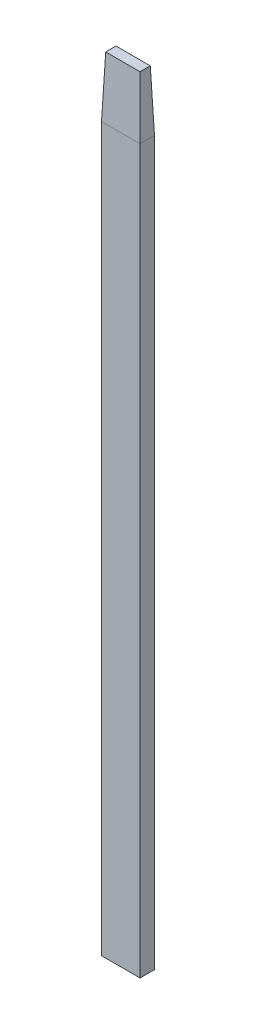
ISO-10303-21;
HEADER;
FILE_DESCRIPTION(('STEP AP214'),'2;1');
FILE_NAME('part.step','',(''),(''),'','','');
FILE_SCHEMA(('AUTOMOTIVE_DESIGN { 1 0 10303 214 1 1 1 1 }'));
ENDSEC;
DATA;
#1=APPLICATION_CONTEXT('core data for automotive mechanical design processes');
#2=APPLICATION_PROTOCOL_DEFINITION('international standard','automotive_design',2000,#1);
#3=PRODUCT_CONTEXT('',#1,'mechanical');
#4=PRODUCT('Part','Part','',(#3));
#5=PRODUCT_RELATED_PRODUCT_CATEGORY('part','',(#4));
#6=PRODUCT_DEFINITION_FORMATION('','',#4);
#7=PRODUCT_DEFINITION_CONTEXT('part definition',#1,'design');
#8=PRODUCT_DEFINITION('design','',#6,#7);
#9=PRODUCT_DEFINITION_SHAPE('','',#8);
#10=(LENGTH_UNIT() NAMED_UNIT(*) SI_UNIT(.MILLI.,.METRE.));
#11=(NAMED_UNIT(*) PLANE_ANGLE_UNIT() SI_UNIT($,.RADIAN.));
#12=(NAMED_UNIT(*) SI_UNIT($,.STERADIAN.) SOLID_ANGLE_UNIT());
#13=UNCERTAINTY_MEASURE_WITH_UNIT(LENGTH_MEASURE(1.E-05),#10,'distance_accuracy_value','');
#14=(GEOMETRIC_REPRESENTATION_CONTEXT(3) GLOBAL_UNCERTAINTY_ASSIGNED_CONTEXT((#13)) GLOBAL_UNIT_ASSIGNED_CONTEXT((#10,
#11,#12)) REPRESENTATION_CONTEXT('',''));
#15=CARTESIAN_POINT('',(0.,0.,0.));
#16=DIRECTION('',(0.,0.,1.));
#17=DIRECTION('',(1.,0.,0.));
#18=AXIS2_PLACEMENT_3D('',#15,#16,#17);
#19=CARTESIAN_POINT('',(-4.8,90.,-1.8));
#20=DIRECTION('',(-0.999390827019096,0.034899496702501,0.));
#21=DIRECTION('',(-0.0348994967025011,-0.999390827019096,0.));
#22=AXIS2_PLACEMENT_3D('',#19,#20,#21);
#23=PLANE('',#22);
#24=DIRECTION('',(0.,0.,1.));
#25=VECTOR('',#24,1.);
#26=CARTESIAN_POINT('',(-4.8,90.,-1.8));
#27=LINE('',#26,#25);
#28=CARTESIAN_POINT('',(-4.8,90.,-1.8));
#29=VERTEX_POINT('',#28);
#30=CARTESIAN_POINT('',(-4.8,90.,1.8));
#31=VERTEX_POINT('',#30);
#32=EDGE_CURVE('E92',#29,#31,#27,.T.);
#33=ORIENTED_EDGE('',*,*,#32,.T.);
#34=DIRECTION('',(-0.0348782627423747,-0.998782765958718,0.0348782627423747));
#35=VECTOR('',#34,1.);
#36=CARTESIAN_POINT('',(-4.8,90.,1.8));
#37=LINE('',#36,#35);
#38=CARTESIAN_POINT('',(-4.27618845762378,105.,1.27618845762378));
#39=VERTEX_POINT('',#38);
#40=EDGE_CURVE('E12',#39,#31,#37,.T.);
#41=ORIENTED_EDGE('',*,*,#40,.F.);
#42=DIRECTION('',(0.,0.,-1.));
#43=VECTOR('',#42,1.);
#44=CARTESIAN_POINT('',(-4.27618845762378,105.,-1.8));
#45=LINE('',#44,#43);
#46=CARTESIAN_POINT('',(-4.27618845762378,105.,-1.27618845762378));
#47=VERTEX_POINT('',#46);
#48=EDGE_CURVE('E105',#47,#39,#45,.F.);
#49=ORIENTED_EDGE('',*,*,#48,.F.);
#50=DIRECTION('',(-0.0348782627423747,-0.998782765958718,-0.0348782627423747));
#51=VECTOR('',#50,1.);
#52=CARTESIAN_POINT('',(-4.8,90.,-1.8));
#53=LINE('',#52,#51);
#54=EDGE_CURVE('E100',#47,#29,#53,.T.);
#55=ORIENTED_EDGE('',*,*,#54,.T.);
#56=EDGE_LOOP('',(#33,#41,#49,#55));
#57=FACE_BOUND('',#56,.T.);
#58=ADVANCED_FACE('F42',(#57),#23,.T.);
#59=CARTESIAN_POINT('',(-4.8,90.,1.8));
#60=DIRECTION('',(0.,0.034899496702501,0.999390827019096));
#61=DIRECTION('',(0.,-0.999390827019096,0.034899496702501));
#62=AXIS2_PLACEMENT_3D('',#59,#60,#61);
#63=PLANE('',#62);
#64=DIRECTION('',(1.,0.,0.));
#65=VECTOR('',#64,1.);
#66=CARTESIAN_POINT('',(-4.8,90.,1.8));
#67=LINE('',#66,#65);
#68=CARTESIAN_POINT('',(4.8,90.,1.8));
#69=VERTEX_POINT('',#68);
#70=EDGE_CURVE('E89',#31,#69,#67,.T.);
#71=ORIENTED_EDGE('',*,*,#70,.T.);
#72=DIRECTION('',(0.0348782627423747,-0.998782765958718,0.0348782627423747));
#73=VECTOR('',#72,1.);
#74=CARTESIAN_POINT('',(4.79562062443707,90.1254089078412,1.79562062443707));
#75=LINE('',#74,#73);
#76=CARTESIAN_POINT('',(4.27618845762379,105.,1.27618845762378));
#77=VERTEX_POINT('',#76);
#78=EDGE_CURVE('E52',#77,#69,#75,.T.);
#79=ORIENTED_EDGE('',*,*,#78,.F.);
#80=DIRECTION('',(-1.,0.,0.));
#81=VECTOR('',#80,1.);
#82=CARTESIAN_POINT('',(-4.8,105.,1.27618845762378));
#83=LINE('',#82,#81);
#84=EDGE_CURVE('E46',#39,#77,#83,.F.);
#85=ORIENTED_EDGE('',*,*,#84,.F.);
#86=ORIENTED_EDGE('',*,*,#40,.T.);
#87=EDGE_LOOP('',(#71,#79,#85,#86));
#88=FACE_BOUND('',#87,.T.);
#89=ADVANCED_FACE('F97',(#88),#63,.T.);
#90=CARTESIAN_POINT('',(4.8,90.,-1.8));
#91=DIRECTION('',(0.999390827019096,0.034899496702501,0.));
#92=DIRECTION('',(-0.034899496702501,0.999390827019096,0.));
#93=AXIS2_PLACEMENT_3D('',#90,#91,#92);
#94=PLANE('',#93);
#95=DIRECTION('',(0.,0.,-1.));
#96=VECTOR('',#95,1.);
#97=CARTESIAN_POINT('',(4.8,90.,-1.8));
#98=LINE('',#97,#96);
#99=CARTESIAN_POINT('',(4.8,90.,-1.8));
#100=VERTEX_POINT('',#99);
#101=EDGE_CURVE('E93',#69,#100,#98,.T.);
#102=ORIENTED_EDGE('',*,*,#101,.T.);
#103=DIRECTION('',(0.0348782627423747,-0.998782765958718,-0.0348782627423747));
#104=VECTOR('',#103,1.);
#105=CARTESIAN_POINT('',(4.78832166516551,90.3344237542432,-1.78832166516551));
#106=LINE('',#105,#104);
#107=CARTESIAN_POINT('',(4.27618845762379,105.,-1.27618845762378));
#108=VERTEX_POINT('',#107);
#109=EDGE_CURVE('E106',#108,#100,#106,.T.);
#110=ORIENTED_EDGE('',*,*,#109,.F.);
#111=DIRECTION('',(0.,0.,1.));
#112=VECTOR('',#111,1.);
#113=CARTESIAN_POINT('',(4.27618845762379,105.,-1.8));
#114=LINE('',#113,#112);
#115=EDGE_CURVE('E110',#77,#108,#114,.F.);
#116=ORIENTED_EDGE('',*,*,#115,.F.);
#117=ORIENTED_EDGE('',*,*,#78,.T.);
#118=EDGE_LOOP('',(#102,#110,#116,#117));
#119=FACE_BOUND('',#118,.T.);
#120=ADVANCED_FACE('F116',(#119),#94,.T.);
#121=CARTESIAN_POINT('',(-4.8,90.,-1.8));
#122=DIRECTION('',(0.,0.034899496702501,-0.999390827019096));
#123=DIRECTION('',(0.,0.999390827019096,0.034899496702501));
#124=AXIS2_PLACEMENT_3D('',#121,#122,#123);
#125=PLANE('',#124);
#126=DIRECTION('',(-1.,0.,0.));
#127=VECTOR('',#126,1.);
#128=CARTESIAN_POINT('',(-4.8,90.,-1.8));
#129=LINE('',#128,#127);
#130=EDGE_CURVE('E76',#100,#29,#129,.T.);
#131=ORIENTED_EDGE('',*,*,#130,.T.);
#132=ORIENTED_EDGE('',*,*,#54,.F.);
#133=DIRECTION('',(1.,0.,0.));
#134=VECTOR('',#133,1.);
#135=CARTESIAN_POINT('',(-4.8,105.,-1.27618845762378));
#136=LINE('',#135,#134);
#137=EDGE_CURVE('E61',#108,#47,#136,.F.);
#138=ORIENTED_EDGE('',*,*,#137,.F.);
#139=ORIENTED_EDGE('',*,*,#109,.T.);
#140=EDGE_LOOP('',(#131,#132,#138,#139));
#141=FACE_BOUND('',#140,.T.);
#142=ADVANCED_FACE('F44',(#141),#125,.T.);
#143=CARTESIAN_POINT('',(0.,105.,0.));
#144=DIRECTION('',(0.,1.,0.));
#145=DIRECTION('',(0.,0.,1.));
#146=AXIS2_PLACEMENT_3D('',#143,#144,#145);
#147=PLANE('',#146);
#148=ORIENTED_EDGE('',*,*,#48,.T.);
#149=ORIENTED_EDGE('',*,*,#84,.T.);
#150=ORIENTED_EDGE('',*,*,#115,.T.);
#151=ORIENTED_EDGE('',*,*,#137,.T.);
#152=EDGE_LOOP('',(#148,#149,#150,#151));
#153=FACE_BOUND('',#152,.T.);
#154=ADVANCED_FACE('F112',(#153),#147,.T.);
#155=CARTESIAN_POINT('',(0.,90.,0.));
#156=DIRECTION('',(0.,1.,0.));
#157=DIRECTION('',(0.,0.,1.));
#158=AXIS2_PLACEMENT_3D('',#155,#156,#157);
#159=PLANE('',#158);
#160=ORIENTED_EDGE('',*,*,#32,.F.);
#161=ORIENTED_EDGE('',*,*,#130,.F.);
#162=ORIENTED_EDGE('',*,*,#101,.F.);
#163=ORIENTED_EDGE('',*,*,#70,.F.);
#164=EDGE_LOOP('',(#160,#161,#162,#163));
#165=FACE_BOUND('',#164,.T.);
#166=ADVANCED_FACE('F90',(#165),#159,.F.);
#167=CLOSED_SHELL('',(#58,#89,#120,#142,#154,#166));
#168=MANIFOLD_SOLID_BREP('B2',#167);
#169=CARTESIAN_POINT('',(4.8,-90.,1.8));
#170=DIRECTION('',(-1.,0.,0.));
#171=DIRECTION('',(0.,0.,1.));
#172=AXIS2_PLACEMENT_3D('',#169,#170,#171);
#173=PLANE('',#172);
#174=DIRECTION('',(0.,1.,0.));
#175=VECTOR('',#174,1.);
#176=CARTESIAN_POINT('',(4.8,-90.,-1.8));
#177=LINE('',#176,#175);
#178=CARTESIAN_POINT('',(4.8,-90.,-1.8));
#179=VERTEX_POINT('',#178);
#180=CARTESIAN_POINT('',(4.8,90.,-1.8));
#181=VERTEX_POINT('',#180);
#182=EDGE_CURVE('E228',#179,#181,#177,.T.);
#183=ORIENTED_EDGE('',*,*,#182,.T.);
#184=DIRECTION('',(0.,0.,-1.));
#185=VECTOR('',#184,1.);
#186=CARTESIAN_POINT('',(4.8,90.,1.8));
#187=LINE('',#186,#185);
#188=CARTESIAN_POINT('',(4.8,90.,1.8));
#189=VERTEX_POINT('',#188);
#190=EDGE_CURVE('E40',#189,#181,#187,.T.);
#191=ORIENTED_EDGE('',*,*,#190,.F.);
#192=DIRECTION('',(0.,1.,0.));
#193=VECTOR('',#192,1.);
#194=CARTESIAN_POINT('',(4.8,-90.,1.8));
#195=LINE('',#194,#193);
#196=CARTESIAN_POINT('',(4.8,-90.,1.8));
#197=VERTEX_POINT('',#196);
#198=EDGE_CURVE('E216',#197,#189,#195,.T.);
#199=ORIENTED_EDGE('',*,*,#198,.F.);
#200=DIRECTION('',(0.,0.,-1.));
#201=VECTOR('',#200,1.);
#202=CARTESIAN_POINT('',(4.8,-90.,1.8));
#203=LINE('',#202,#201);
#204=EDGE_CURVE('E224',#197,#179,#203,.T.);
#205=ORIENTED_EDGE('',*,*,#204,.T.);
#206=EDGE_LOOP('',(#183,#191,#199,#205));
#207=FACE_BOUND('',#206,.T.);
#208=ADVANCED_FACE('F165',(#207),#173,.F.);
#209=CARTESIAN_POINT('',(-4.8,90.,1.8));
#210=DIRECTION('',(0.,-1.,0.));
#211=DIRECTION('',(0.,0.,-1.));
#212=AXIS2_PLACEMENT_3D('',#209,#210,#211);
#213=PLANE('',#212);
#214=DIRECTION('',(-1.,0.,0.));
#215=VECTOR('',#214,1.);
#216=CARTESIAN_POINT('',(-4.8,90.,-1.8));
#217=LINE('',#216,#215);
#218=CARTESIAN_POINT('',(-4.8,90.,-1.8));
#219=VERTEX_POINT('',#218);
#220=EDGE_CURVE('E220',#181,#219,#217,.T.);
#221=ORIENTED_EDGE('',*,*,#220,.T.);
#222=DIRECTION('',(0.,0.,-1.));
#223=VECTOR('',#222,1.);
#224=CARTESIAN_POINT('',(-4.8,90.,1.8));
#225=LINE('',#224,#223);
#226=CARTESIAN_POINT('',(-4.8,90.,1.8));
#227=VERTEX_POINT('',#226);
#228=EDGE_CURVE('E173',#227,#219,#225,.T.);
#229=ORIENTED_EDGE('',*,*,#228,.F.);
#230=DIRECTION('',(-1.,0.,0.));
#231=VECTOR('',#230,1.);
#232=CARTESIAN_POINT('',(-4.8,90.,1.8));
#233=LINE('',#232,#231);
#234=EDGE_CURVE('E211',#189,#227,#233,.T.);
#235=ORIENTED_EDGE('',*,*,#234,.F.);
#236=ORIENTED_EDGE('',*,*,#190,.T.);
#237=EDGE_LOOP('',(#221,#229,#235,#236));
#238=FACE_BOUND('',#237,.T.);
#239=ADVANCED_FACE('F219',(#238),#213,.F.);
#240=CARTESIAN_POINT('',(-4.8,-90.,1.8));
#241=DIRECTION('',(1.,0.,0.));
#242=DIRECTION('',(0.,0.,-1.));
#243=AXIS2_PLACEMENT_3D('',#240,#241,#242);
#244=PLANE('',#243);
#245=DIRECTION('',(0.,-1.,0.));
#246=VECTOR('',#245,1.);
#247=CARTESIAN_POINT('',(-4.8,-90.,-1.8));
#248=LINE('',#247,#246);
#249=CARTESIAN_POINT('',(-4.8,-90.,-1.8));
#250=VERTEX_POINT('',#249);
#251=EDGE_CURVE('E198',#219,#250,#248,.T.);
#252=ORIENTED_EDGE('',*,*,#251,.T.);
#253=DIRECTION('',(0.,0.,-1.));
#254=VECTOR('',#253,1.);
#255=CARTESIAN_POINT('',(-4.8,-90.,1.8));
#256=LINE('',#255,#254);
#257=CARTESIAN_POINT('',(-4.8,-90.,1.8));
#258=VERTEX_POINT('',#257);
#259=EDGE_CURVE('E221',#258,#250,#256,.T.);
#260=ORIENTED_EDGE('',*,*,#259,.F.);
#261=DIRECTION('',(0.,-1.,0.));
#262=VECTOR('',#261,1.);
#263=CARTESIAN_POINT('',(-4.8,-90.,1.8));
#264=LINE('',#263,#262);
#265=EDGE_CURVE('E214',#227,#258,#264,.T.);
#266=ORIENTED_EDGE('',*,*,#265,.F.);
#267=ORIENTED_EDGE('',*,*,#228,.T.);
#268=EDGE_LOOP('',(#252,#260,#266,#267));
#269=FACE_BOUND('',#268,.T.);
#270=ADVANCED_FACE('F222',(#269),#244,.F.);
#271=CARTESIAN_POINT('',(-4.8,-90.,1.8));
#272=DIRECTION('',(0.,1.,0.));
#273=DIRECTION('',(0.,0.,1.));
#274=AXIS2_PLACEMENT_3D('',#271,#272,#273);
#275=PLANE('',#274);
#276=DIRECTION('',(1.,0.,0.));
#277=VECTOR('',#276,1.);
#278=CARTESIAN_POINT('',(-4.8,-90.,-1.8));
#279=LINE('',#278,#277);
#280=EDGE_CURVE('E204',#250,#179,#279,.T.);
#281=ORIENTED_EDGE('',*,*,#280,.T.);
#282=ORIENTED_EDGE('',*,*,#204,.F.);
#283=DIRECTION('',(1.,0.,0.));
#284=VECTOR('',#283,1.);
#285=CARTESIAN_POINT('',(-4.8,-90.,1.8));
#286=LINE('',#285,#284);
#287=EDGE_CURVE('E181',#258,#197,#286,.T.);
#288=ORIENTED_EDGE('',*,*,#287,.F.);
#289=ORIENTED_EDGE('',*,*,#259,.T.);
#290=EDGE_LOOP('',(#281,#282,#288,#289));
#291=FACE_BOUND('',#290,.T.);
#292=ADVANCED_FACE('F235',(#291),#275,.F.);
#293=CARTESIAN_POINT('',(0.,0.,1.8));
#294=DIRECTION('',(0.,0.,-1.));
#295=DIRECTION('',(-1.,0.,0.));
#296=AXIS2_PLACEMENT_3D('',#293,#294,#295);
#297=PLANE('',#296);
#298=ORIENTED_EDGE('',*,*,#198,.T.);
#299=ORIENTED_EDGE('',*,*,#234,.T.);
#300=ORIENTED_EDGE('',*,*,#265,.T.);
#301=ORIENTED_EDGE('',*,*,#287,.T.);
#302=EDGE_LOOP('',(#298,#299,#300,#301));
#303=FACE_BOUND('',#302,.T.);
#304=ADVANCED_FACE('F212',(#303),#297,.F.);
#305=CARTESIAN_POINT('',(0.,0.,-1.8));
#306=DIRECTION('',(0.,0.,-1.));
#307=DIRECTION('',(-1.,0.,0.));
#308=AXIS2_PLACEMENT_3D('',#305,#306,#307);
#309=PLANE('',#308);
#310=ORIENTED_EDGE('',*,*,#182,.F.);
#311=ORIENTED_EDGE('',*,*,#280,.F.);
#312=ORIENTED_EDGE('',*,*,#251,.F.);
#313=ORIENTED_EDGE('',*,*,#220,.F.);
#314=EDGE_LOOP('',(#310,#311,#312,#313));
#315=FACE_BOUND('',#314,.T.);
#316=ADVANCED_FACE('F238',(#315),#309,.T.);
#317=CLOSED_SHELL('',(#208,#239,#270,#292,#304,#316));
#318=MANIFOLD_SOLID_BREP('B6',#317);
#319=ADVANCED_BREP_SHAPE_REPRESENTATION('',(#18,#168,#318),#14);
#320=SHAPE_DEFINITION_REPRESENTATION(#9,#319);
ENDSEC;
END-ISO-10303-21;
